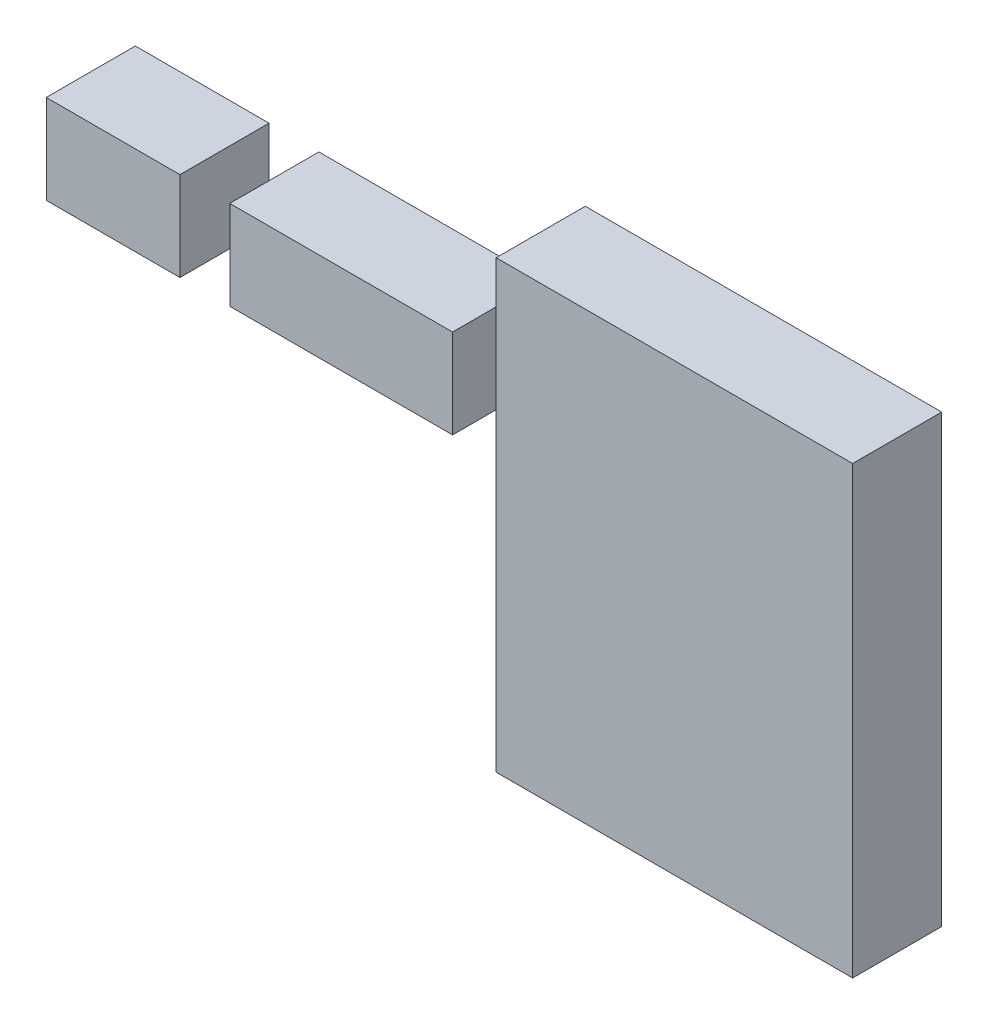
ISO-10303-21;
HEADER;
FILE_DESCRIPTION(('STEP AP214'),'2;1');
FILE_NAME('part.step','',(''),(''),'','','');
FILE_SCHEMA(('AUTOMOTIVE_DESIGN { 1 0 10303 214 1 1 1 1 }'));
ENDSEC;
DATA;
#1=APPLICATION_CONTEXT('core data for automotive mechanical design processes');
#2=APPLICATION_PROTOCOL_DEFINITION('international standard','automotive_design',2000,#1);
#3=PRODUCT_CONTEXT('',#1,'mechanical');
#4=PRODUCT('Part','Part','',(#3));
#5=PRODUCT_RELATED_PRODUCT_CATEGORY('part','',(#4));
#6=PRODUCT_DEFINITION_FORMATION('','',#4);
#7=PRODUCT_DEFINITION_CONTEXT('part definition',#1,'design');
#8=PRODUCT_DEFINITION('design','',#6,#7);
#9=PRODUCT_DEFINITION_SHAPE('','',#8);
#10=(LENGTH_UNIT() NAMED_UNIT(*) SI_UNIT(.MILLI.,.METRE.));
#11=(NAMED_UNIT(*) PLANE_ANGLE_UNIT() SI_UNIT($,.RADIAN.));
#12=(NAMED_UNIT(*) SI_UNIT($,.STERADIAN.) SOLID_ANGLE_UNIT());
#13=UNCERTAINTY_MEASURE_WITH_UNIT(LENGTH_MEASURE(1.E-05),#10,'distance_accuracy_value','');
#14=(GEOMETRIC_REPRESENTATION_CONTEXT(3) GLOBAL_UNCERTAINTY_ASSIGNED_CONTEXT((#13)) GLOBAL_UNIT_ASSIGNED_CONTEXT((#10,
#11,#12)) REPRESENTATION_CONTEXT('',''));
#15=CARTESIAN_POINT('',(0.,0.,0.));
#16=DIRECTION('',(0.,0.,1.));
#17=DIRECTION('',(1.,0.,0.));
#18=AXIS2_PLACEMENT_3D('',#15,#16,#17);
#19=CARTESIAN_POINT('',(-18.0977401786434,8.06583011089743,2.));
#20=DIRECTION('',(1.,0.,0.));
#21=DIRECTION('',(0.,0.,-1.));
#22=AXIS2_PLACEMENT_3D('',#19,#20,#21);
#23=PLANE('',#22);
#24=DIRECTION('',(0.,-1.,0.));
#25=VECTOR('',#24,1.);
#26=CARTESIAN_POINT('',(-18.0977401786434,8.06583011089743,0.));
#27=LINE('',#26,#25);
#28=CARTESIAN_POINT('',(-18.0977401786434,8.06583011089743,0.));
#29=VERTEX_POINT('',#28);
#30=CARTESIAN_POINT('',(-18.0977401786434,6.06583011089743,0.));
#31=VERTEX_POINT('',#30);
#32=EDGE_CURVE('E107',#29,#31,#27,.T.);
#33=ORIENTED_EDGE('',*,*,#32,.T.);
#34=DIRECTION('',(0.,0.,-1.));
#35=VECTOR('',#34,1.);
#36=CARTESIAN_POINT('',(-18.0977401786434,6.06583011089743,2.));
#37=LINE('',#36,#35);
#38=CARTESIAN_POINT('',(-18.0977401786434,6.06583011089743,2.));
#39=VERTEX_POINT('',#38);
#40=EDGE_CURVE('E12',#39,#31,#37,.T.);
#41=ORIENTED_EDGE('',*,*,#40,.F.);
#42=DIRECTION('',(0.,-1.,0.));
#43=VECTOR('',#42,1.);
#44=CARTESIAN_POINT('',(-18.0977401786434,8.06583011089743,2.));
#45=LINE('',#44,#43);
#46=CARTESIAN_POINT('',(-18.0977401786434,8.06583011089743,2.));
#47=VERTEX_POINT('',#46);
#48=EDGE_CURVE('E95',#47,#39,#45,.T.);
#49=ORIENTED_EDGE('',*,*,#48,.F.);
#50=DIRECTION('',(0.,0.,-1.));
#51=VECTOR('',#50,1.);
#52=CARTESIAN_POINT('',(-18.0977401786434,8.06583011089743,2.));
#53=LINE('',#52,#51);
#54=EDGE_CURVE('E103',#47,#29,#53,.T.);
#55=ORIENTED_EDGE('',*,*,#54,.T.);
#56=EDGE_LOOP('',(#33,#41,#49,#55));
#57=FACE_BOUND('',#56,.T.);
#58=ADVANCED_FACE('F44',(#57),#23,.F.);
#59=CARTESIAN_POINT('',(-18.0977401786434,6.06583011089743,2.));
#60=DIRECTION('',(0.,1.,0.));
#61=DIRECTION('',(0.,0.,1.));
#62=AXIS2_PLACEMENT_3D('',#59,#60,#61);
#63=PLANE('',#62);
#64=DIRECTION('',(1.,0.,0.));
#65=VECTOR('',#64,1.);
#66=CARTESIAN_POINT('',(-18.0977401786434,6.06583011089743,0.));
#67=LINE('',#66,#65);
#68=CARTESIAN_POINT('',(-15.0977401786434,6.06583011089743,0.));
#69=VERTEX_POINT('',#68);
#70=EDGE_CURVE('E99',#31,#69,#67,.T.);
#71=ORIENTED_EDGE('',*,*,#70,.T.);
#72=DIRECTION('',(0.,0.,-1.));
#73=VECTOR('',#72,1.);
#74=CARTESIAN_POINT('',(-15.0977401786434,6.06583011089743,2.));
#75=LINE('',#74,#73);
#76=CARTESIAN_POINT('',(-15.0977401786434,6.06583011089743,2.));
#77=VERTEX_POINT('',#76);
#78=EDGE_CURVE('E52',#77,#69,#75,.T.);
#79=ORIENTED_EDGE('',*,*,#78,.F.);
#80=DIRECTION('',(1.,0.,0.));
#81=VECTOR('',#80,1.);
#82=CARTESIAN_POINT('',(-18.0977401786434,6.06583011089743,2.));
#83=LINE('',#82,#81);
#84=EDGE_CURVE('E90',#39,#77,#83,.T.);
#85=ORIENTED_EDGE('',*,*,#84,.F.);
#86=ORIENTED_EDGE('',*,*,#40,.T.);
#87=EDGE_LOOP('',(#71,#79,#85,#86));
#88=FACE_BOUND('',#87,.T.);
#89=ADVANCED_FACE('F98',(#88),#63,.F.);
#90=CARTESIAN_POINT('',(-15.0977401786434,8.06583011089743,2.));
#91=DIRECTION('',(-1.,0.,0.));
#92=DIRECTION('',(0.,0.,1.));
#93=AXIS2_PLACEMENT_3D('',#90,#91,#92);
#94=PLANE('',#93);
#95=DIRECTION('',(0.,1.,0.));
#96=VECTOR('',#95,1.);
#97=CARTESIAN_POINT('',(-15.0977401786434,8.06583011089743,0.));
#98=LINE('',#97,#96);
#99=CARTESIAN_POINT('',(-15.0977401786434,8.06583011089743,0.));
#100=VERTEX_POINT('',#99);
#101=EDGE_CURVE('E77',#69,#100,#98,.T.);
#102=ORIENTED_EDGE('',*,*,#101,.T.);
#103=DIRECTION('',(0.,0.,-1.));
#104=VECTOR('',#103,1.);
#105=CARTESIAN_POINT('',(-15.0977401786434,8.06583011089743,2.));
#106=LINE('',#105,#104);
#107=CARTESIAN_POINT('',(-15.0977401786434,8.06583011089743,2.));
#108=VERTEX_POINT('',#107);
#109=EDGE_CURVE('E100',#108,#100,#106,.T.);
#110=ORIENTED_EDGE('',*,*,#109,.F.);
#111=DIRECTION('',(0.,1.,0.));
#112=VECTOR('',#111,1.);
#113=CARTESIAN_POINT('',(-15.0977401786434,8.06583011089743,2.));
#114=LINE('',#113,#112);
#115=EDGE_CURVE('E93',#77,#108,#114,.T.);
#116=ORIENTED_EDGE('',*,*,#115,.F.);
#117=ORIENTED_EDGE('',*,*,#78,.T.);
#118=EDGE_LOOP('',(#102,#110,#116,#117));
#119=FACE_BOUND('',#118,.T.);
#120=ADVANCED_FACE('F101',(#119),#94,.F.);
#121=CARTESIAN_POINT('',(-18.0977401786434,8.06583011089743,2.));
#122=DIRECTION('',(0.,-1.,0.));
#123=DIRECTION('',(0.,0.,-1.));
#124=AXIS2_PLACEMENT_3D('',#121,#122,#123);
#125=PLANE('',#124);
#126=DIRECTION('',(-1.,0.,0.));
#127=VECTOR('',#126,1.);
#128=CARTESIAN_POINT('',(-18.0977401786434,8.06583011089743,0.));
#129=LINE('',#128,#127);
#130=EDGE_CURVE('E83',#100,#29,#129,.T.);
#131=ORIENTED_EDGE('',*,*,#130,.T.);
#132=ORIENTED_EDGE('',*,*,#54,.F.);
#133=DIRECTION('',(-1.,0.,0.));
#134=VECTOR('',#133,1.);
#135=CARTESIAN_POINT('',(-18.0977401786434,8.06583011089743,2.));
#136=LINE('',#135,#134);
#137=EDGE_CURVE('E60',#108,#47,#136,.T.);
#138=ORIENTED_EDGE('',*,*,#137,.F.);
#139=ORIENTED_EDGE('',*,*,#109,.T.);
#140=EDGE_LOOP('',(#131,#132,#138,#139));
#141=FACE_BOUND('',#140,.T.);
#142=ADVANCED_FACE('F114',(#141),#125,.F.);
#143=CARTESIAN_POINT('',(0.,0.,2.));
#144=DIRECTION('',(0.,0.,1.));
#145=DIRECTION('',(1.,0.,0.));
#146=AXIS2_PLACEMENT_3D('',#143,#144,#145);
#147=PLANE('',#146);
#148=ORIENTED_EDGE('',*,*,#48,.T.);
#149=ORIENTED_EDGE('',*,*,#84,.T.);
#150=ORIENTED_EDGE('',*,*,#115,.T.);
#151=ORIENTED_EDGE('',*,*,#137,.T.);
#152=EDGE_LOOP('',(#148,#149,#150,#151));
#153=FACE_BOUND('',#152,.T.);
#154=ADVANCED_FACE('F91',(#153),#147,.T.);
#155=CARTESIAN_POINT('',(0.,0.,0.));
#156=DIRECTION('',(0.,0.,1.));
#157=DIRECTION('',(1.,0.,0.));
#158=AXIS2_PLACEMENT_3D('',#155,#156,#157);
#159=PLANE('',#158);
#160=ORIENTED_EDGE('',*,*,#32,.F.);
#161=ORIENTED_EDGE('',*,*,#130,.F.);
#162=ORIENTED_EDGE('',*,*,#101,.F.);
#163=ORIENTED_EDGE('',*,*,#70,.F.);
#164=EDGE_LOOP('',(#160,#161,#162,#163));
#165=FACE_BOUND('',#164,.T.);
#166=ADVANCED_FACE('F117',(#165),#159,.F.);
#167=CLOSED_SHELL('',(#58,#89,#120,#142,#154,#166));
#168=MANIFOLD_SOLID_BREP('B2',#167);
#169=CARTESIAN_POINT('',(-13.9789359405599,8.06583011089743,2.));
#170=DIRECTION('',(1.,0.,0.));
#171=DIRECTION('',(0.,0.,-1.));
#172=AXIS2_PLACEMENT_3D('',#169,#170,#171);
#173=PLANE('',#172);
#174=DIRECTION('',(0.,-1.,0.));
#175=VECTOR('',#174,1.);
#176=CARTESIAN_POINT('',(-13.9789359405599,8.06583011089743,0.));
#177=LINE('',#176,#175);
#178=CARTESIAN_POINT('',(-13.9789359405599,8.06583011089743,0.));
#179=VERTEX_POINT('',#178);
#180=CARTESIAN_POINT('',(-13.9789359405599,6.06583011089743,0.));
#181=VERTEX_POINT('',#180);
#182=EDGE_CURVE('E240',#179,#181,#177,.T.);
#183=ORIENTED_EDGE('',*,*,#182,.T.);
#184=DIRECTION('',(0.,0.,-1.));
#185=VECTOR('',#184,1.);
#186=CARTESIAN_POINT('',(-13.9789359405599,6.06583011089743,2.));
#187=LINE('',#186,#185);
#188=CARTESIAN_POINT('',(-13.9789359405599,6.06583011089743,2.));
#189=VERTEX_POINT('',#188);
#190=EDGE_CURVE('E42',#189,#181,#187,.T.);
#191=ORIENTED_EDGE('',*,*,#190,.F.);
#192=DIRECTION('',(0.,-1.,0.));
#193=VECTOR('',#192,1.);
#194=CARTESIAN_POINT('',(-13.9789359405599,8.06583011089743,2.));
#195=LINE('',#194,#193);
#196=CARTESIAN_POINT('',(-13.9789359405599,8.06583011089743,2.));
#197=VERTEX_POINT('',#196);
#198=EDGE_CURVE('E228',#197,#189,#195,.T.);
#199=ORIENTED_EDGE('',*,*,#198,.F.);
#200=DIRECTION('',(0.,0.,-1.));
#201=VECTOR('',#200,1.);
#202=CARTESIAN_POINT('',(-13.9789359405599,8.06583011089743,2.));
#203=LINE('',#202,#201);
#204=EDGE_CURVE('E236',#197,#179,#203,.T.);
#205=ORIENTED_EDGE('',*,*,#204,.T.);
#206=EDGE_LOOP('',(#183,#191,#199,#205));
#207=FACE_BOUND('',#206,.T.);
#208=ADVANCED_FACE('F177',(#207),#173,.F.);
#209=CARTESIAN_POINT('',(-13.9789359405599,6.06583011089743,2.));
#210=DIRECTION('',(0.,1.,0.));
#211=DIRECTION('',(0.,0.,1.));
#212=AXIS2_PLACEMENT_3D('',#209,#210,#211);
#213=PLANE('',#212);
#214=DIRECTION('',(1.,0.,0.));
#215=VECTOR('',#214,1.);
#216=CARTESIAN_POINT('',(-13.9789359405599,6.06583011089743,0.));
#217=LINE('',#216,#215);
#218=CARTESIAN_POINT('',(-8.97893594055994,6.06583011089743,0.));
#219=VERTEX_POINT('',#218);
#220=EDGE_CURVE('E232',#181,#219,#217,.T.);
#221=ORIENTED_EDGE('',*,*,#220,.T.);
#222=DIRECTION('',(0.,0.,-1.));
#223=VECTOR('',#222,1.);
#224=CARTESIAN_POINT('',(-8.97893594055994,6.06583011089743,2.));
#225=LINE('',#224,#223);
#226=CARTESIAN_POINT('',(-8.97893594055994,6.06583011089743,2.));
#227=VERTEX_POINT('',#226);
#228=EDGE_CURVE('E185',#227,#219,#225,.T.);
#229=ORIENTED_EDGE('',*,*,#228,.F.);
#230=DIRECTION('',(1.,0.,0.));
#231=VECTOR('',#230,1.);
#232=CARTESIAN_POINT('',(-13.9789359405599,6.06583011089743,2.));
#233=LINE('',#232,#231);
#234=EDGE_CURVE('E223',#189,#227,#233,.T.);
#235=ORIENTED_EDGE('',*,*,#234,.F.);
#236=ORIENTED_EDGE('',*,*,#190,.T.);
#237=EDGE_LOOP('',(#221,#229,#235,#236));
#238=FACE_BOUND('',#237,.T.);
#239=ADVANCED_FACE('F231',(#238),#213,.F.);
#240=CARTESIAN_POINT('',(-8.97893594055994,8.06583011089743,2.));
#241=DIRECTION('',(-1.,0.,0.));
#242=DIRECTION('',(0.,0.,1.));
#243=AXIS2_PLACEMENT_3D('',#240,#241,#242);
#244=PLANE('',#243);
#245=DIRECTION('',(0.,1.,0.));
#246=VECTOR('',#245,1.);
#247=CARTESIAN_POINT('',(-8.97893594055994,8.06583011089743,0.));
#248=LINE('',#247,#246);
#249=CARTESIAN_POINT('',(-8.97893594055994,8.06583011089743,0.));
#250=VERTEX_POINT('',#249);
#251=EDGE_CURVE('E210',#219,#250,#248,.T.);
#252=ORIENTED_EDGE('',*,*,#251,.T.);
#253=DIRECTION('',(0.,0.,-1.));
#254=VECTOR('',#253,1.);
#255=CARTESIAN_POINT('',(-8.97893594055994,8.06583011089743,2.));
#256=LINE('',#255,#254);
#257=CARTESIAN_POINT('',(-8.97893594055994,8.06583011089743,2.));
#258=VERTEX_POINT('',#257);
#259=EDGE_CURVE('E233',#258,#250,#256,.T.);
#260=ORIENTED_EDGE('',*,*,#259,.F.);
#261=DIRECTION('',(0.,1.,0.));
#262=VECTOR('',#261,1.);
#263=CARTESIAN_POINT('',(-8.97893594055994,8.06583011089743,2.));
#264=LINE('',#263,#262);
#265=EDGE_CURVE('E226',#227,#258,#264,.T.);
#266=ORIENTED_EDGE('',*,*,#265,.F.);
#267=ORIENTED_EDGE('',*,*,#228,.T.);
#268=EDGE_LOOP('',(#252,#260,#266,#267));
#269=FACE_BOUND('',#268,.T.);
#270=ADVANCED_FACE('F234',(#269),#244,.F.);
#271=CARTESIAN_POINT('',(-13.9789359405599,8.06583011089743,2.));
#272=DIRECTION('',(0.,-1.,0.));
#273=DIRECTION('',(0.,0.,-1.));
#274=AXIS2_PLACEMENT_3D('',#271,#272,#273);
#275=PLANE('',#274);
#276=DIRECTION('',(-1.,0.,0.));
#277=VECTOR('',#276,1.);
#278=CARTESIAN_POINT('',(-13.9789359405599,8.06583011089743,0.));
#279=LINE('',#278,#277);
#280=EDGE_CURVE('E216',#250,#179,#279,.T.);
#281=ORIENTED_EDGE('',*,*,#280,.T.);
#282=ORIENTED_EDGE('',*,*,#204,.F.);
#283=DIRECTION('',(-1.,0.,0.));
#284=VECTOR('',#283,1.);
#285=CARTESIAN_POINT('',(-13.9789359405599,8.06583011089743,2.));
#286=LINE('',#285,#284);
#287=EDGE_CURVE('E193',#258,#197,#286,.T.);
#288=ORIENTED_EDGE('',*,*,#287,.F.);
#289=ORIENTED_EDGE('',*,*,#259,.T.);
#290=EDGE_LOOP('',(#281,#282,#288,#289));
#291=FACE_BOUND('',#290,.T.);
#292=ADVANCED_FACE('F247',(#291),#275,.F.);
#293=CARTESIAN_POINT('',(0.,0.,2.));
#294=DIRECTION('',(0.,0.,1.));
#295=DIRECTION('',(1.,0.,0.));
#296=AXIS2_PLACEMENT_3D('',#293,#294,#295);
#297=PLANE('',#296);
#298=ORIENTED_EDGE('',*,*,#198,.T.);
#299=ORIENTED_EDGE('',*,*,#234,.T.);
#300=ORIENTED_EDGE('',*,*,#265,.T.);
#301=ORIENTED_EDGE('',*,*,#287,.T.);
#302=EDGE_LOOP('',(#298,#299,#300,#301));
#303=FACE_BOUND('',#302,.T.);
#304=ADVANCED_FACE('F224',(#303),#297,.T.);
#305=CARTESIAN_POINT('',(0.,0.,0.));
#306=DIRECTION('',(0.,0.,1.));
#307=DIRECTION('',(1.,0.,0.));
#308=AXIS2_PLACEMENT_3D('',#305,#306,#307);
#309=PLANE('',#308);
#310=ORIENTED_EDGE('',*,*,#182,.F.);
#311=ORIENTED_EDGE('',*,*,#280,.F.);
#312=ORIENTED_EDGE('',*,*,#251,.F.);
#313=ORIENTED_EDGE('',*,*,#220,.F.);
#314=EDGE_LOOP('',(#310,#311,#312,#313));
#315=FACE_BOUND('',#314,.T.);
#316=ADVANCED_FACE('F250',(#315),#309,.F.);
#317=CLOSED_SHELL('',(#208,#239,#270,#292,#304,#316));
#318=MANIFOLD_SOLID_BREP('B6',#317);
#319=CARTESIAN_POINT('',(0.,0.,2.));
#320=DIRECTION('',(-1.,0.,0.));
#321=DIRECTION('',(0.,0.,1.));
#322=AXIS2_PLACEMENT_3D('',#319,#320,#321);
#323=PLANE('',#322);
#324=DIRECTION('',(0.,1.,0.));
#325=VECTOR('',#324,1.);
#326=CARTESIAN_POINT('',(0.,0.,0.));
#327=LINE('',#326,#325);
#328=CARTESIAN_POINT('',(0.,0.,0.));
#329=VERTEX_POINT('',#328);
#330=CARTESIAN_POINT('',(0.,10.,0.));
#331=VERTEX_POINT('',#330);
#332=EDGE_CURVE('E364',#329,#331,#327,.T.);
#333=ORIENTED_EDGE('',*,*,#332,.T.);
#334=DIRECTION('',(0.,0.,-1.));
#335=VECTOR('',#334,1.);
#336=CARTESIAN_POINT('',(0.,10.,2.));
#337=LINE('',#336,#335);
#338=CARTESIAN_POINT('',(0.,10.,2.));
#339=VERTEX_POINT('',#338);
#340=EDGE_CURVE('E175',#339,#331,#337,.T.);
#341=ORIENTED_EDGE('',*,*,#340,.F.);
#342=DIRECTION('',(0.,1.,0.));
#343=VECTOR('',#342,1.);
#344=CARTESIAN_POINT('',(0.,0.,2.));
#345=LINE('',#344,#343);
#346=CARTESIAN_POINT('',(0.,0.,2.));
#347=VERTEX_POINT('',#346);
#348=EDGE_CURVE('E352',#347,#339,#345,.T.);
#349=ORIENTED_EDGE('',*,*,#348,.F.);
#350=DIRECTION('',(0.,0.,-1.));
#351=VECTOR('',#350,1.);
#352=CARTESIAN_POINT('',(0.,0.,2.));
#353=LINE('',#352,#351);
#354=EDGE_CURVE('E360',#347,#329,#353,.T.);
#355=ORIENTED_EDGE('',*,*,#354,.T.);
#356=EDGE_LOOP('',(#333,#341,#349,#355));
#357=FACE_BOUND('',#356,.T.);
#358=ADVANCED_FACE('F301',(#357),#323,.F.);
#359=CARTESIAN_POINT('',(0.,10.,2.));
#360=DIRECTION('',(0.,-1.,0.));
#361=DIRECTION('',(1.,0.,0.));
#362=AXIS2_PLACEMENT_3D('',#359,#360,#361);
#363=PLANE('',#362);
#364=DIRECTION('',(-1.,0.,0.));
#365=VECTOR('',#364,1.);
#366=CARTESIAN_POINT('',(0.,10.,0.));
#367=LINE('',#366,#365);
#368=CARTESIAN_POINT('',(-8.,10.,0.));
#369=VERTEX_POINT('',#368);
#370=EDGE_CURVE('E356',#331,#369,#367,.T.);
#371=ORIENTED_EDGE('',*,*,#370,.T.);
#372=DIRECTION('',(0.,0.,-1.));
#373=VECTOR('',#372,1.);
#374=CARTESIAN_POINT('',(-8.,10.,2.));
#375=LINE('',#374,#373);
#376=CARTESIAN_POINT('',(-8.,10.,2.));
#377=VERTEX_POINT('',#376);
#378=EDGE_CURVE('E309',#377,#369,#375,.T.);
#379=ORIENTED_EDGE('',*,*,#378,.F.);
#380=DIRECTION('',(-1.,0.,0.));
#381=VECTOR('',#380,1.);
#382=CARTESIAN_POINT('',(0.,10.,2.));
#383=LINE('',#382,#381);
#384=EDGE_CURVE('E347',#339,#377,#383,.T.);
#385=ORIENTED_EDGE('',*,*,#384,.F.);
#386=ORIENTED_EDGE('',*,*,#340,.T.);
#387=EDGE_LOOP('',(#371,#379,#385,#386));
#388=FACE_BOUND('',#387,.T.);
#389=ADVANCED_FACE('F355',(#388),#363,.F.);
#390=CARTESIAN_POINT('',(-8.,0.,2.));
#391=DIRECTION('',(1.,0.,0.));
#392=DIRECTION('',(0.,0.,-1.));
#393=AXIS2_PLACEMENT_3D('',#390,#391,#392);
#394=PLANE('',#393);
#395=DIRECTION('',(0.,-1.,0.));
#396=VECTOR('',#395,1.);
#397=CARTESIAN_POINT('',(-8.,0.,0.));
#398=LINE('',#397,#396);
#399=CARTESIAN_POINT('',(-8.,0.,0.));
#400=VERTEX_POINT('',#399);
#401=EDGE_CURVE('E334',#369,#400,#398,.T.);
#402=ORIENTED_EDGE('',*,*,#401,.T.);
#403=DIRECTION('',(0.,0.,-1.));
#404=VECTOR('',#403,1.);
#405=CARTESIAN_POINT('',(-8.,0.,2.));
#406=LINE('',#405,#404);
#407=CARTESIAN_POINT('',(-8.,0.,2.));
#408=VERTEX_POINT('',#407);
#409=EDGE_CURVE('E357',#408,#400,#406,.T.);
#410=ORIENTED_EDGE('',*,*,#409,.F.);
#411=DIRECTION('',(0.,-1.,0.));
#412=VECTOR('',#411,1.);
#413=CARTESIAN_POINT('',(-8.,0.,2.));
#414=LINE('',#413,#412);
#415=EDGE_CURVE('E350',#377,#408,#414,.T.);
#416=ORIENTED_EDGE('',*,*,#415,.F.);
#417=ORIENTED_EDGE('',*,*,#378,.T.);
#418=EDGE_LOOP('',(#402,#410,#416,#417));
#419=FACE_BOUND('',#418,.T.);
#420=ADVANCED_FACE('F358',(#419),#394,.F.);
#421=CARTESIAN_POINT('',(0.,0.,2.));
#422=DIRECTION('',(0.,1.,0.));
#423=DIRECTION('',(-1.,0.,0.));
#424=AXIS2_PLACEMENT_3D('',#421,#422,#423);
#425=PLANE('',#424);
#426=DIRECTION('',(1.,0.,0.));
#427=VECTOR('',#426,1.);
#428=CARTESIAN_POINT('',(0.,0.,0.));
#429=LINE('',#428,#427);
#430=EDGE_CURVE('E340',#400,#329,#429,.T.);
#431=ORIENTED_EDGE('',*,*,#430,.T.);
#432=ORIENTED_EDGE('',*,*,#354,.F.);
#433=DIRECTION('',(1.,0.,0.));
#434=VECTOR('',#433,1.);
#435=CARTESIAN_POINT('',(0.,0.,2.));
#436=LINE('',#435,#434);
#437=EDGE_CURVE('E317',#408,#347,#436,.T.);
#438=ORIENTED_EDGE('',*,*,#437,.F.);
#439=ORIENTED_EDGE('',*,*,#409,.T.);
#440=EDGE_LOOP('',(#431,#432,#438,#439));
#441=FACE_BOUND('',#440,.T.);
#442=ADVANCED_FACE('F371',(#441),#425,.F.);
#443=CARTESIAN_POINT('',(0.,0.,2.));
#444=DIRECTION('',(0.,0.,1.));
#445=DIRECTION('',(1.,0.,0.));
#446=AXIS2_PLACEMENT_3D('',#443,#444,#445);
#447=PLANE('',#446);
#448=ORIENTED_EDGE('',*,*,#348,.T.);
#449=ORIENTED_EDGE('',*,*,#384,.T.);
#450=ORIENTED_EDGE('',*,*,#415,.T.);
#451=ORIENTED_EDGE('',*,*,#437,.T.);
#452=EDGE_LOOP('',(#448,#449,#450,#451));
#453=FACE_BOUND('',#452,.T.);
#454=ADVANCED_FACE('F348',(#453),#447,.T.);
#455=CARTESIAN_POINT('',(0.,0.,0.));
#456=DIRECTION('',(0.,0.,1.));
#457=DIRECTION('',(1.,0.,0.));
#458=AXIS2_PLACEMENT_3D('',#455,#456,#457);
#459=PLANE('',#458);
#460=ORIENTED_EDGE('',*,*,#332,.F.);
#461=ORIENTED_EDGE('',*,*,#430,.F.);
#462=ORIENTED_EDGE('',*,*,#401,.F.);
#463=ORIENTED_EDGE('',*,*,#370,.F.);
#464=EDGE_LOOP('',(#460,#461,#462,#463));
#465=FACE_BOUND('',#464,.T.);
#466=ADVANCED_FACE('F374',(#465),#459,.F.);
#467=CLOSED_SHELL('',(#358,#389,#420,#442,#454,#466));
#468=MANIFOLD_SOLID_BREP('B36',#467);
#469=ADVANCED_BREP_SHAPE_REPRESENTATION('',(#18,#168,#318,#468),#14);
#470=SHAPE_DEFINITION_REPRESENTATION(#9,#469);
ENDSEC;
END-ISO-10303-21;
